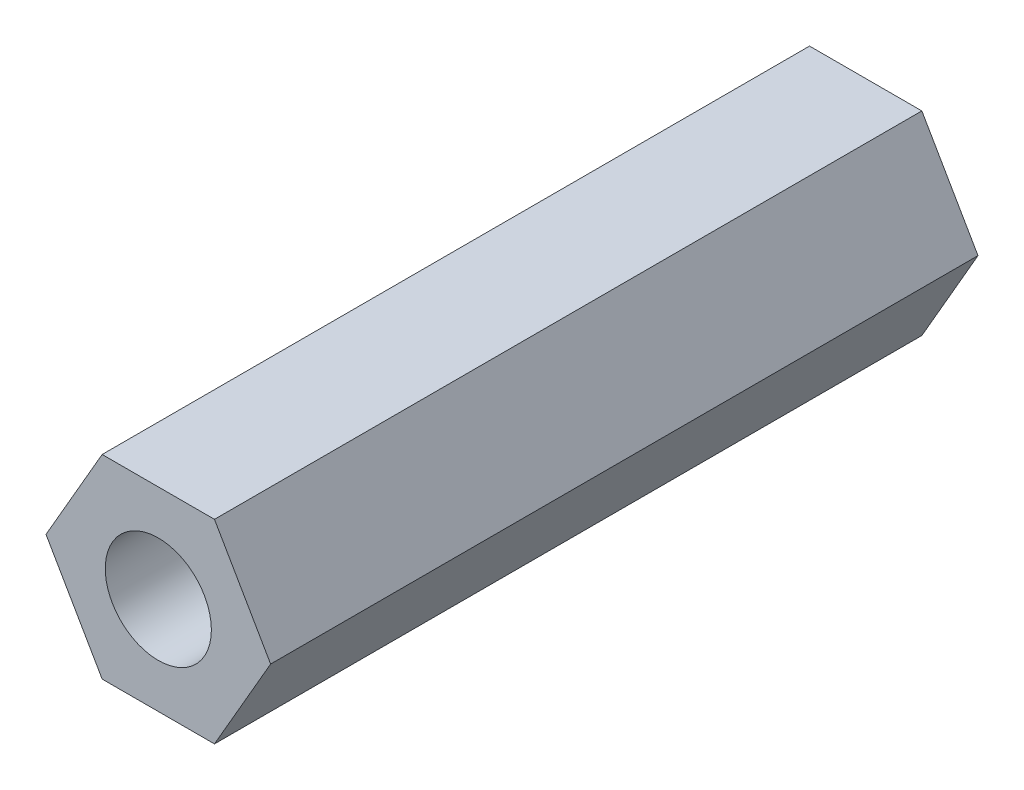
ISO-10303-21;
HEADER;
FILE_DESCRIPTION(('STEP AP214'),'2;1');
FILE_NAME('part.step','',(''),(''),'','','');
FILE_SCHEMA(('AUTOMOTIVE_DESIGN { 1 0 10303 214 1 1 1 1 }'));
ENDSEC;
DATA;
#1=APPLICATION_CONTEXT('core data for automotive mechanical design processes');
#2=APPLICATION_PROTOCOL_DEFINITION('international standard','automotive_design',2000,#1);
#3=PRODUCT_CONTEXT('',#1,'mechanical');
#4=PRODUCT('Part','Part','',(#3));
#5=PRODUCT_RELATED_PRODUCT_CATEGORY('part','',(#4));
#6=PRODUCT_DEFINITION_FORMATION('','',#4);
#7=PRODUCT_DEFINITION_CONTEXT('part definition',#1,'design');
#8=PRODUCT_DEFINITION('design','',#6,#7);
#9=PRODUCT_DEFINITION_SHAPE('','',#8);
#10=(LENGTH_UNIT() NAMED_UNIT(*) SI_UNIT(.MILLI.,.METRE.));
#11=(NAMED_UNIT(*) PLANE_ANGLE_UNIT() SI_UNIT($,.RADIAN.));
#12=(NAMED_UNIT(*) SI_UNIT($,.STERADIAN.) SOLID_ANGLE_UNIT());
#13=UNCERTAINTY_MEASURE_WITH_UNIT(LENGTH_MEASURE(1.E-05),#10,'distance_accuracy_value','');
#14=(GEOMETRIC_REPRESENTATION_CONTEXT(3) GLOBAL_UNCERTAINTY_ASSIGNED_CONTEXT((#13)) GLOBAL_UNIT_ASSIGNED_CONTEXT((#10,
#11,#12)) REPRESENTATION_CONTEXT('',''));
#15=CARTESIAN_POINT('',(0.,0.,0.));
#16=DIRECTION('',(0.,0.,1.));
#17=DIRECTION('',(1.,0.,0.));
#18=AXIS2_PLACEMENT_3D('',#15,#16,#17);
#19=CARTESIAN_POINT('',(0.,0.,20.));
#20=DIRECTION('',(0.,0.,1.));
#21=DIRECTION('',(1.,0.,0.));
#22=AXIS2_PLACEMENT_3D('',#19,#20,#21);
#23=PLANE('',#22);
#24=DIRECTION('',(0.499999999999995,0.866025403784441,0.));
#25=VECTOR('',#24,1.);
#26=CARTESIAN_POINT('',(1.5877132402715,-2.74999999999998,20.));
#27=LINE('',#26,#25);
#28=CARTESIAN_POINT('',(1.5877132402715,-2.74999999999998,20.));
#29=VERTEX_POINT('',#28);
#30=CARTESIAN_POINT('',(3.17542648054294,0.,20.));
#31=VERTEX_POINT('',#30);
#32=EDGE_CURVE('E130',#29,#31,#27,.T.);
#33=ORIENTED_EDGE('',*,*,#32,.T.);
#34=DIRECTION('',(-0.500000000000001,0.866025403784438,0.));
#35=VECTOR('',#34,1.);
#36=CARTESIAN_POINT('',(3.17542648054294,0.,20.));
#37=LINE('',#36,#35);
#38=CARTESIAN_POINT('',(1.58771324027147,2.75,20.));
#39=VERTEX_POINT('',#38);
#40=EDGE_CURVE('E88',#31,#39,#37,.T.);
#41=ORIENTED_EDGE('',*,*,#40,.T.);
#42=DIRECTION('',(-1.,0.,0.));
#43=VECTOR('',#42,1.);
#44=CARTESIAN_POINT('',(1.58771324027147,2.75,20.));
#45=LINE('',#44,#43);
#46=CARTESIAN_POINT('',(-1.58771324027148,2.74999999999999,20.));
#47=VERTEX_POINT('',#46);
#48=EDGE_CURVE('E101',#39,#47,#45,.T.);
#49=ORIENTED_EDGE('',*,*,#48,.T.);
#50=DIRECTION('',(-0.499999999999995,-0.866025403784442,0.));
#51=VECTOR('',#50,1.);
#52=CARTESIAN_POINT('',(-1.58771324027148,2.74999999999999,20.));
#53=LINE('',#52,#51);
#54=CARTESIAN_POINT('',(-3.17542648054294,0.,20.));
#55=VERTEX_POINT('',#54);
#56=EDGE_CURVE('E95',#47,#55,#53,.T.);
#57=ORIENTED_EDGE('',*,*,#56,.T.);
#58=DIRECTION('',(0.500000000000007,-0.866025403784435,0.));
#59=VECTOR('',#58,1.);
#60=CARTESIAN_POINT('',(-3.17542648054294,0.,20.));
#61=LINE('',#60,#59);
#62=CARTESIAN_POINT('',(-1.58771324027145,-2.75000000000002,20.));
#63=VERTEX_POINT('',#62);
#64=EDGE_CURVE('E99',#55,#63,#61,.T.);
#65=ORIENTED_EDGE('',*,*,#64,.T.);
#66=DIRECTION('',(1.,0.,0.));
#67=VECTOR('',#66,1.);
#68=CARTESIAN_POINT('',(-1.58771324027145,-2.75000000000002,20.));
#69=LINE('',#68,#67);
#70=EDGE_CURVE('E51',#63,#29,#69,.T.);
#71=ORIENTED_EDGE('',*,*,#70,.T.);
#72=EDGE_LOOP('',(#33,#41,#49,#57,#65,#71));
#73=FACE_BOUND('',#72,.T.);
#74=CARTESIAN_POINT('',(0.,0.,20.));
#75=DIRECTION('',(0.,0.,1.));
#76=DIRECTION('',(1.,0.,0.));
#77=AXIS2_PLACEMENT_3D('',#74,#75,#76);
#78=CIRCLE('',#77,1.5);
#79=CARTESIAN_POINT('',(1.5,0.,20.));
#80=VERTEX_POINT('',#79);
#81=EDGE_CURVE('E123',#80,#80,#78,.T.);
#82=ORIENTED_EDGE('',*,*,#81,.F.);
#83=EDGE_LOOP('',(#82));
#84=FACE_BOUND('',#83,.T.);
#85=ADVANCED_FACE('F34',(#73,#84),#23,.T.);
#86=CARTESIAN_POINT('',(0.,0.,0.));
#87=DIRECTION('',(0.,0.,1.));
#88=DIRECTION('',(1.,0.,0.));
#89=AXIS2_PLACEMENT_3D('',#86,#87,#88);
#90=PLANE('',#89);
#91=DIRECTION('',(0.499999999999995,0.866025403784441,0.));
#92=VECTOR('',#91,1.);
#93=CARTESIAN_POINT('',(1.5877132402715,-2.74999999999998,0.));
#94=LINE('',#93,#92);
#95=CARTESIAN_POINT('',(1.5877132402715,-2.74999999999998,0.));
#96=VERTEX_POINT('',#95);
#97=CARTESIAN_POINT('',(3.17542648054294,0.,0.));
#98=VERTEX_POINT('',#97);
#99=EDGE_CURVE('E119',#96,#98,#94,.T.);
#100=ORIENTED_EDGE('',*,*,#99,.F.);
#101=DIRECTION('',(1.,0.,0.));
#102=VECTOR('',#101,1.);
#103=CARTESIAN_POINT('',(-1.58771324027145,-2.75000000000002,0.));
#104=LINE('',#103,#102);
#105=CARTESIAN_POINT('',(-1.58771324027145,-2.75000000000002,0.));
#106=VERTEX_POINT('',#105);
#107=EDGE_CURVE('E80',#106,#96,#104,.T.);
#108=ORIENTED_EDGE('',*,*,#107,.F.);
#109=DIRECTION('',(0.500000000000007,-0.866025403784435,0.));
#110=VECTOR('',#109,1.);
#111=CARTESIAN_POINT('',(-3.17542648054294,0.,0.));
#112=LINE('',#111,#110);
#113=CARTESIAN_POINT('',(-3.17542648054294,0.,0.));
#114=VERTEX_POINT('',#113);
#115=EDGE_CURVE('E74',#114,#106,#112,.T.);
#116=ORIENTED_EDGE('',*,*,#115,.F.);
#117=DIRECTION('',(-0.499999999999995,-0.866025403784442,0.));
#118=VECTOR('',#117,1.);
#119=CARTESIAN_POINT('',(-1.58771324027148,2.74999999999999,0.));
#120=LINE('',#119,#118);
#121=CARTESIAN_POINT('',(-1.58771324027148,2.74999999999999,0.));
#122=VERTEX_POINT('',#121);
#123=EDGE_CURVE('E109',#122,#114,#120,.T.);
#124=ORIENTED_EDGE('',*,*,#123,.F.);
#125=DIRECTION('',(-1.,0.,0.));
#126=VECTOR('',#125,1.);
#127=CARTESIAN_POINT('',(1.58771324027147,2.75,0.));
#128=LINE('',#127,#126);
#129=CARTESIAN_POINT('',(1.58771324027147,2.75,0.));
#130=VERTEX_POINT('',#129);
#131=EDGE_CURVE('E125',#130,#122,#128,.T.);
#132=ORIENTED_EDGE('',*,*,#131,.F.);
#133=DIRECTION('',(-0.500000000000001,0.866025403784438,0.));
#134=VECTOR('',#133,1.);
#135=CARTESIAN_POINT('',(3.17542648054294,0.,0.));
#136=LINE('',#135,#134);
#137=EDGE_CURVE('E122',#98,#130,#136,.T.);
#138=ORIENTED_EDGE('',*,*,#137,.F.);
#139=EDGE_LOOP('',(#100,#108,#116,#124,#132,#138));
#140=FACE_BOUND('',#139,.T.);
#141=CARTESIAN_POINT('',(0.,0.,0.));
#142=DIRECTION('',(0.,0.,1.));
#143=DIRECTION('',(1.,0.,0.));
#144=AXIS2_PLACEMENT_3D('',#141,#142,#143);
#145=CIRCLE('',#144,1.5);
#146=CARTESIAN_POINT('',(1.5,0.,0.));
#147=VERTEX_POINT('',#146);
#148=EDGE_CURVE('E223',#147,#147,#145,.T.);
#149=ORIENTED_EDGE('',*,*,#148,.T.);
#150=EDGE_LOOP('',(#149));
#151=FACE_BOUND('',#150,.T.);
#152=ADVANCED_FACE('F139',(#140,#151),#90,.F.);
#153=CARTESIAN_POINT('',(1.5877132402715,-2.74999999999998,20.));
#154=DIRECTION('',(-0.866025403784442,0.499999999999995,0.));
#155=DIRECTION('',(-0.499999999999995,-0.866025403784442,0.));
#156=AXIS2_PLACEMENT_3D('',#153,#154,#155);
#157=PLANE('',#156);
#158=ORIENTED_EDGE('',*,*,#99,.T.);
#159=DIRECTION('',(0.,0.,-1.));
#160=VECTOR('',#159,1.);
#161=CARTESIAN_POINT('',(3.17542648054294,0.,20.));
#162=LINE('',#161,#160);
#163=EDGE_CURVE('E11',#31,#98,#162,.T.);
#164=ORIENTED_EDGE('',*,*,#163,.F.);
#165=ORIENTED_EDGE('',*,*,#32,.F.);
#166=DIRECTION('',(0.,0.,-1.));
#167=VECTOR('',#166,1.);
#168=CARTESIAN_POINT('',(1.5877132402715,-2.74999999999998,20.));
#169=LINE('',#168,#167);
#170=EDGE_CURVE('E115',#29,#96,#169,.T.);
#171=ORIENTED_EDGE('',*,*,#170,.T.);
#172=EDGE_LOOP('',(#158,#164,#165,#171));
#173=FACE_BOUND('',#172,.T.);
#174=ADVANCED_FACE('F36',(#173),#157,.F.);
#175=CARTESIAN_POINT('',(3.17542648054294,0.,20.));
#176=DIRECTION('',(-0.866025403784438,-0.500000000000001,0.));
#177=DIRECTION('',(0.500000000000001,-0.866025403784438,0.));
#178=AXIS2_PLACEMENT_3D('',#175,#176,#177);
#179=PLANE('',#178);
#180=ORIENTED_EDGE('',*,*,#137,.T.);
#181=DIRECTION('',(0.,0.,-1.));
#182=VECTOR('',#181,1.);
#183=CARTESIAN_POINT('',(1.58771324027147,2.75,20.));
#184=LINE('',#183,#182);
#185=EDGE_CURVE('E43',#39,#130,#184,.T.);
#186=ORIENTED_EDGE('',*,*,#185,.F.);
#187=ORIENTED_EDGE('',*,*,#40,.F.);
#188=ORIENTED_EDGE('',*,*,#163,.T.);
#189=EDGE_LOOP('',(#180,#186,#187,#188));
#190=FACE_BOUND('',#189,.T.);
#191=ADVANCED_FACE('F164',(#190),#179,.F.);
#192=CARTESIAN_POINT('',(1.58771324027147,2.75,20.));
#193=DIRECTION('',(0.,-1.,0.));
#194=DIRECTION('',(1.,0.,0.));
#195=AXIS2_PLACEMENT_3D('',#192,#193,#194);
#196=PLANE('',#195);
#197=ORIENTED_EDGE('',*,*,#131,.T.);
#198=DIRECTION('',(0.,0.,-1.));
#199=VECTOR('',#198,1.);
#200=CARTESIAN_POINT('',(-1.58771324027148,2.74999999999999,20.));
#201=LINE('',#200,#199);
#202=EDGE_CURVE('E110',#47,#122,#201,.T.);
#203=ORIENTED_EDGE('',*,*,#202,.F.);
#204=ORIENTED_EDGE('',*,*,#48,.F.);
#205=ORIENTED_EDGE('',*,*,#185,.T.);
#206=EDGE_LOOP('',(#197,#203,#204,#205));
#207=FACE_BOUND('',#206,.T.);
#208=ADVANCED_FACE('F136',(#207),#196,.F.);
#209=CARTESIAN_POINT('',(-1.58771324027148,2.74999999999999,20.));
#210=DIRECTION('',(0.866025403784442,-0.499999999999995,0.));
#211=DIRECTION('',(0.499999999999995,0.866025403784442,0.));
#212=AXIS2_PLACEMENT_3D('',#209,#210,#211);
#213=PLANE('',#212);
#214=ORIENTED_EDGE('',*,*,#123,.T.);
#215=DIRECTION('',(0.,0.,-1.));
#216=VECTOR('',#215,1.);
#217=CARTESIAN_POINT('',(-3.17542648054294,0.,20.));
#218=LINE('',#217,#216);
#219=EDGE_CURVE('E106',#55,#114,#218,.T.);
#220=ORIENTED_EDGE('',*,*,#219,.F.);
#221=ORIENTED_EDGE('',*,*,#56,.F.);
#222=ORIENTED_EDGE('',*,*,#202,.T.);
#223=EDGE_LOOP('',(#214,#220,#221,#222));
#224=FACE_BOUND('',#223,.T.);
#225=ADVANCED_FACE('F107',(#224),#213,.F.);
#226=CARTESIAN_POINT('',(-3.17542648054294,0.,20.));
#227=DIRECTION('',(0.866025403784435,0.500000000000007,0.));
#228=DIRECTION('',(-0.500000000000007,0.866025403784435,0.));
#229=AXIS2_PLACEMENT_3D('',#226,#227,#228);
#230=PLANE('',#229);
#231=ORIENTED_EDGE('',*,*,#115,.T.);
#232=DIRECTION('',(0.,0.,-1.));
#233=VECTOR('',#232,1.);
#234=CARTESIAN_POINT('',(-1.58771324027145,-2.75000000000002,20.));
#235=LINE('',#234,#233);
#236=EDGE_CURVE('E111',#63,#106,#235,.T.);
#237=ORIENTED_EDGE('',*,*,#236,.F.);
#238=ORIENTED_EDGE('',*,*,#64,.F.);
#239=ORIENTED_EDGE('',*,*,#219,.T.);
#240=EDGE_LOOP('',(#231,#237,#238,#239));
#241=FACE_BOUND('',#240,.T.);
#242=ADVANCED_FACE('F113',(#241),#230,.F.);
#243=CARTESIAN_POINT('',(-1.58771324027145,-2.75000000000002,20.));
#244=DIRECTION('',(0.,1.,0.));
#245=DIRECTION('',(-1.,0.,0.));
#246=AXIS2_PLACEMENT_3D('',#243,#244,#245);
#247=PLANE('',#246);
#248=ORIENTED_EDGE('',*,*,#107,.T.);
#249=ORIENTED_EDGE('',*,*,#170,.F.);
#250=ORIENTED_EDGE('',*,*,#70,.F.);
#251=ORIENTED_EDGE('',*,*,#236,.T.);
#252=EDGE_LOOP('',(#248,#249,#250,#251));
#253=FACE_BOUND('',#252,.T.);
#254=ADVANCED_FACE('F144',(#253),#247,.F.);
#255=CARTESIAN_POINT('',(0.,0.,20.));
#256=DIRECTION('',(0.,0.,-1.));
#257=DIRECTION('',(-1.,0.,0.));
#258=AXIS2_PLACEMENT_3D('',#255,#256,#257);
#259=CYLINDRICAL_SURFACE('',#258,1.5);
#260=ORIENTED_EDGE('',*,*,#81,.T.);
#261=EDGE_LOOP('',(#260));
#262=FACE_BOUND('',#261,.T.);
#263=ORIENTED_EDGE('',*,*,#148,.F.);
#264=EDGE_LOOP('',(#263));
#265=FACE_BOUND('',#264,.T.);
#266=ADVANCED_FACE('F146',(#262,#265),#259,.F.);
#267=CLOSED_SHELL('',(#85,#152,#174,#191,#208,#225,#242,#254,#266));
#268=MANIFOLD_SOLID_BREP('B2',#267);
#269=ADVANCED_BREP_SHAPE_REPRESENTATION('',(#18,#268),#14);
#270=SHAPE_DEFINITION_REPRESENTATION(#9,#269);
ENDSEC;
END-ISO-10303-21;
